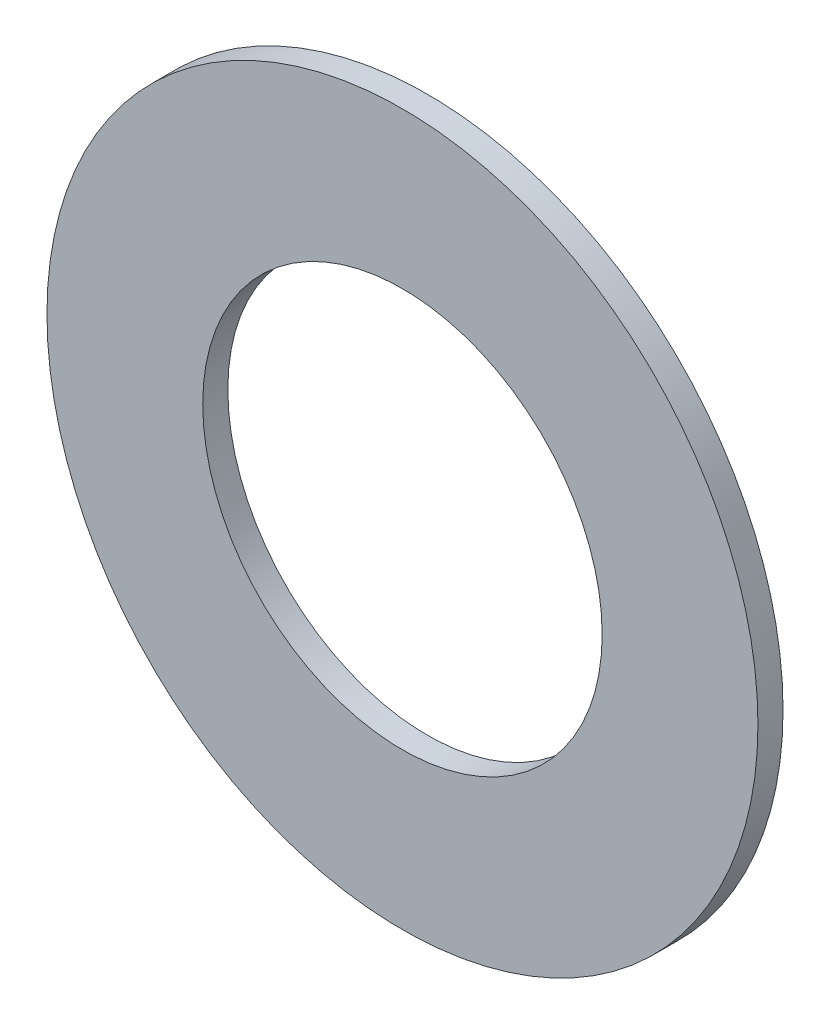
ISO-10303-21;
HEADER;
FILE_DESCRIPTION(('STEP AP214'),'2;1');
FILE_NAME('part.step','',(''),(''),'','','');
FILE_SCHEMA(('AUTOMOTIVE_DESIGN { 1 0 10303 214 1 1 1 1 }'));
ENDSEC;
DATA;
#1=APPLICATION_CONTEXT('core data for automotive mechanical design processes');
#2=APPLICATION_PROTOCOL_DEFINITION('international standard','automotive_design',2000,#1);
#3=PRODUCT_CONTEXT('',#1,'mechanical');
#4=PRODUCT('Part','Part','',(#3));
#5=PRODUCT_RELATED_PRODUCT_CATEGORY('part','',(#4));
#6=PRODUCT_DEFINITION_FORMATION('','',#4);
#7=PRODUCT_DEFINITION_CONTEXT('part definition',#1,'design');
#8=PRODUCT_DEFINITION('design','',#6,#7);
#9=PRODUCT_DEFINITION_SHAPE('','',#8);
#10=(LENGTH_UNIT() NAMED_UNIT(*) SI_UNIT(.MILLI.,.METRE.));
#11=(NAMED_UNIT(*) PLANE_ANGLE_UNIT() SI_UNIT($,.RADIAN.));
#12=(NAMED_UNIT(*) SI_UNIT($,.STERADIAN.) SOLID_ANGLE_UNIT());
#13=UNCERTAINTY_MEASURE_WITH_UNIT(LENGTH_MEASURE(1.E-05),#10,'distance_accuracy_value','');
#14=(GEOMETRIC_REPRESENTATION_CONTEXT(3) GLOBAL_UNCERTAINTY_ASSIGNED_CONTEXT((#13)) GLOBAL_UNIT_ASSIGNED_CONTEXT((#10,
#11,#12)) REPRESENTATION_CONTEXT('',''));
#15=CARTESIAN_POINT('',(0.,0.,0.));
#16=DIRECTION('',(0.,0.,1.));
#17=DIRECTION('',(1.,0.,0.));
#18=AXIS2_PLACEMENT_3D('',#15,#16,#17);
#19=CARTESIAN_POINT('',(0.,0.,-1.57));
#20=DIRECTION('',(0.,0.,1.));
#21=DIRECTION('',(1.,0.,0.));
#22=AXIS2_PLACEMENT_3D('',#19,#20,#21);
#23=CYLINDRICAL_SURFACE('',#22,22.25);
#24=CARTESIAN_POINT('',(0.,0.,-1.57));
#25=DIRECTION('',(0.,0.,1.));
#26=DIRECTION('',(1.,0.,0.));
#27=AXIS2_PLACEMENT_3D('',#24,#25,#26);
#28=CIRCLE('',#27,22.25);
#29=CARTESIAN_POINT('',(22.25,0.,-1.57));
#30=VERTEX_POINT('',#29);
#31=EDGE_CURVE('E10',#30,#30,#28,.T.);
#32=ORIENTED_EDGE('',*,*,#31,.T.);
#33=EDGE_LOOP('',(#32));
#34=FACE_BOUND('',#33,.T.);
#35=CARTESIAN_POINT('',(0.,0.,0.));
#36=DIRECTION('',(0.,0.,1.));
#37=DIRECTION('',(1.,0.,0.));
#38=AXIS2_PLACEMENT_3D('',#35,#36,#37);
#39=CIRCLE('',#38,22.25);
#40=CARTESIAN_POINT('',(22.25,0.,0.));
#41=VERTEX_POINT('',#40);
#42=EDGE_CURVE('E35',#41,#41,#39,.T.);
#43=ORIENTED_EDGE('',*,*,#42,.F.);
#44=EDGE_LOOP('',(#43));
#45=FACE_BOUND('',#44,.T.);
#46=ADVANCED_FACE('F32',(#34,#45),#23,.T.);
#47=CARTESIAN_POINT('',(0.,0.,-1.57));
#48=DIRECTION('',(0.,0.,1.));
#49=DIRECTION('',(1.,0.,0.));
#50=AXIS2_PLACEMENT_3D('',#47,#48,#49);
#51=PLANE('',#50);
#52=CARTESIAN_POINT('',(0.,0.,-1.57));
#53=DIRECTION('',(0.,0.,1.));
#54=DIRECTION('',(1.,0.,0.));
#55=AXIS2_PLACEMENT_3D('',#52,#53,#54);
#56=CIRCLE('',#55,12.5);
#57=CARTESIAN_POINT('',(12.5,0.,-1.57));
#58=VERTEX_POINT('',#57);
#59=EDGE_CURVE('E42',#58,#58,#56,.T.);
#60=ORIENTED_EDGE('',*,*,#59,.T.);
#61=EDGE_LOOP('',(#60));
#62=FACE_BOUND('',#61,.T.);
#63=ORIENTED_EDGE('',*,*,#31,.F.);
#64=EDGE_LOOP('',(#63));
#65=FACE_BOUND('',#64,.T.);
#66=ADVANCED_FACE('F50',(#62,#65),#51,.F.);
#67=CARTESIAN_POINT('',(0.,0.,0.));
#68=DIRECTION('',(0.,0.,1.));
#69=DIRECTION('',(1.,0.,0.));
#70=AXIS2_PLACEMENT_3D('',#67,#68,#69);
#71=PLANE('',#70);
#72=CARTESIAN_POINT('',(0.,0.,0.));
#73=DIRECTION('',(0.,0.,1.));
#74=DIRECTION('',(1.,0.,0.));
#75=AXIS2_PLACEMENT_3D('',#72,#73,#74);
#76=CIRCLE('',#75,12.5);
#77=CARTESIAN_POINT('',(12.5,0.,0.));
#78=VERTEX_POINT('',#77);
#79=EDGE_CURVE('E44',#78,#78,#76,.T.);
#80=ORIENTED_EDGE('',*,*,#79,.F.);
#81=EDGE_LOOP('',(#80));
#82=FACE_BOUND('',#81,.T.);
#83=ORIENTED_EDGE('',*,*,#42,.T.);
#84=EDGE_LOOP('',(#83));
#85=FACE_BOUND('',#84,.T.);
#86=ADVANCED_FACE('F56',(#82,#85),#71,.T.);
#87=CARTESIAN_POINT('',(0.,0.,-1.57));
#88=DIRECTION('',(0.,0.,1.));
#89=DIRECTION('',(1.,0.,0.));
#90=AXIS2_PLACEMENT_3D('',#87,#88,#89);
#91=CYLINDRICAL_SURFACE('',#90,12.5);
#92=ORIENTED_EDGE('',*,*,#59,.F.);
#93=EDGE_LOOP('',(#92));
#94=FACE_BOUND('',#93,.T.);
#95=ORIENTED_EDGE('',*,*,#79,.T.);
#96=EDGE_LOOP('',(#95));
#97=FACE_BOUND('',#96,.T.);
#98=ADVANCED_FACE('F53',(#94,#97),#91,.F.);
#99=CLOSED_SHELL('',(#46,#66,#86,#98));
#100=MANIFOLD_SOLID_BREP('B2',#99);
#101=ADVANCED_BREP_SHAPE_REPRESENTATION('',(#18,#100),#14);
#102=SHAPE_DEFINITION_REPRESENTATION(#9,#101);
ENDSEC;
END-ISO-10303-21;
